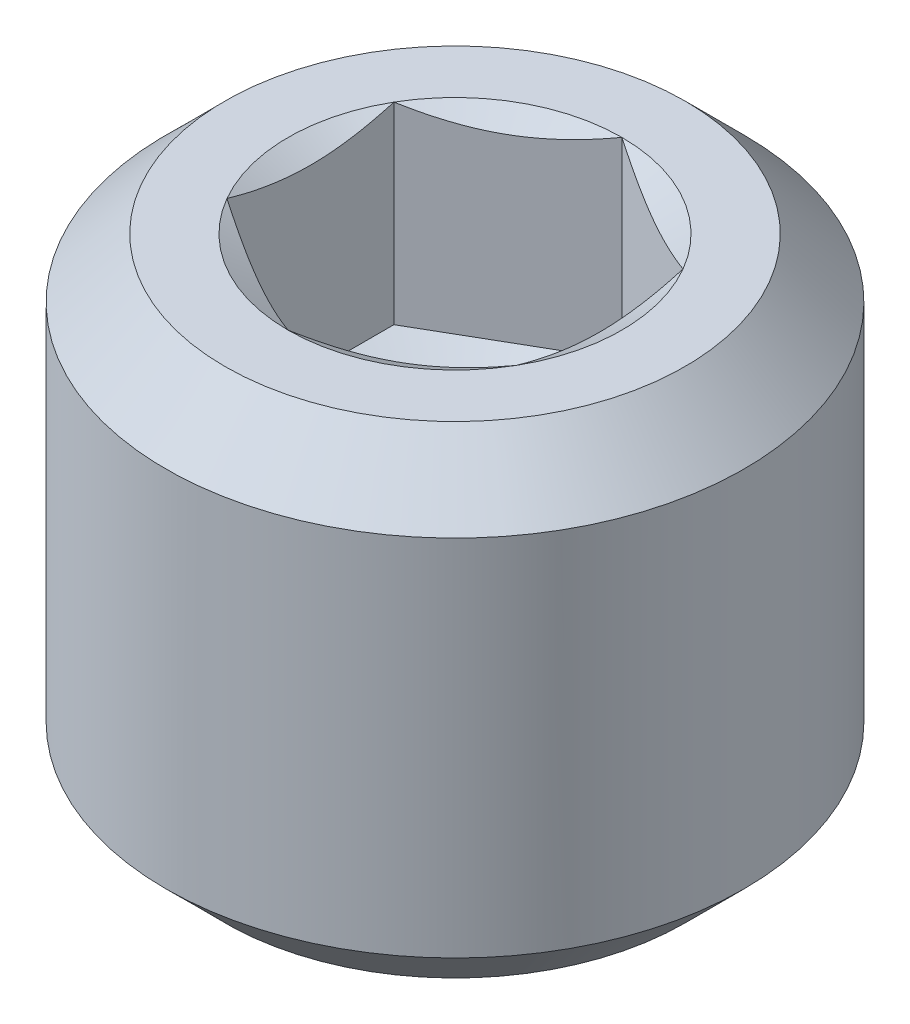
ISO-10303-21;
HEADER;
FILE_DESCRIPTION(('STEP AP214'),'2;1');
FILE_NAME('part.step','',(''),(''),'','','');
FILE_SCHEMA(('AUTOMOTIVE_DESIGN { 1 0 10303 214 1 1 1 1 }'));
ENDSEC;
DATA;
#1=APPLICATION_CONTEXT('core data for automotive mechanical design processes');
#2=APPLICATION_PROTOCOL_DEFINITION('international standard','automotive_design',2000,#1);
#3=PRODUCT_CONTEXT('',#1,'mechanical');
#4=PRODUCT('Part','Part','',(#3));
#5=PRODUCT_RELATED_PRODUCT_CATEGORY('part','',(#4));
#6=PRODUCT_DEFINITION_FORMATION('','',#4);
#7=PRODUCT_DEFINITION_CONTEXT('part definition',#1,'design');
#8=PRODUCT_DEFINITION('design','',#6,#7);
#9=PRODUCT_DEFINITION_SHAPE('','',#8);
#10=(LENGTH_UNIT() NAMED_UNIT(*) SI_UNIT(.MILLI.,.METRE.));
#11=(NAMED_UNIT(*) PLANE_ANGLE_UNIT() SI_UNIT($,.RADIAN.));
#12=(NAMED_UNIT(*) SI_UNIT($,.STERADIAN.) SOLID_ANGLE_UNIT());
#13=UNCERTAINTY_MEASURE_WITH_UNIT(LENGTH_MEASURE(1.E-05),#10,'distance_accuracy_value','');
#14=(GEOMETRIC_REPRESENTATION_CONTEXT(3) GLOBAL_UNCERTAINTY_ASSIGNED_CONTEXT((#13)) GLOBAL_UNIT_ASSIGNED_CONTEXT((#10,
#11,#12)) REPRESENTATION_CONTEXT('',''));
#15=CARTESIAN_POINT('',(0.,0.,0.));
#16=DIRECTION('',(0.,0.,1.));
#17=DIRECTION('',(1.,0.,0.));
#18=AXIS2_PLACEMENT_3D('',#15,#16,#17);
#19=CARTESIAN_POINT('',(0.,18.,17.5660254037844));
#20=DIRECTION('',(0.,1.,0.));
#21=DIRECTION('',(0.,0.,1.));
#22=AXIS2_PLACEMENT_3D('',#19,#20,#21);
#23=PLANE('',#22);
#24=CARTESIAN_POINT('',(0.,18.0000000000138,16.7));
#25=DIRECTION('',(0.,1.,0.));
#26=DIRECTION('',(0.,0.,1.));
#27=AXIS2_PLACEMENT_3D('',#24,#25,#26);
#28=CIRCLE('',#27,1.73205080763255);
#29=CARTESIAN_POINT('',(0.,17.9999999999124,14.9679491924546));
#30=VERTEX_POINT('',#29);
#31=CARTESIAN_POINT('',(1.50000000005516,18.0000000000138,15.8339745961838));
#32=VERTEX_POINT('',#31);
#33=EDGE_CURVE('E20',#30,#32,#28,.F.);
#34=ORIENTED_EDGE('',*,*,#33,.T.);
#35=DIRECTION('',(0.866025403784423,0.,0.500000000000027));
#36=VECTOR('',#35,1.);
#37=CARTESIAN_POINT('',(0.,18.,14.9679491924311));
#38=LINE('',#37,#36);
#39=EDGE_CURVE('E85',#30,#32,#38,.T.);
#40=ORIENTED_EDGE('',*,*,#39,.F.);
#41=EDGE_LOOP('',(#34,#40));
#42=FACE_BOUND('',#41,.T.);
#43=ADVANCED_FACE('F17',(#42),#23,.F.);
#44=CARTESIAN_POINT('',(0.,18.,17.5660254037844));
#45=DIRECTION('',(0.,1.,0.));
#46=DIRECTION('',(0.,0.,1.));
#47=AXIS2_PLACEMENT_3D('',#44,#45,#46);
#48=PLANE('',#47);
#49=CARTESIAN_POINT('',(0.,18.0000000000138,16.7));
#50=DIRECTION('',(0.,1.,0.));
#51=DIRECTION('',(0.,0.,1.));
#52=AXIS2_PLACEMENT_3D('',#49,#50,#51);
#53=CIRCLE('',#52,1.73205080763255);
#54=CARTESIAN_POINT('',(1.50000000005516,18.0000000000138,17.5660254038163));
#55=VERTEX_POINT('',#54);
#56=EDGE_CURVE('E112',#32,#55,#53,.F.);
#57=ORIENTED_EDGE('',*,*,#56,.T.);
#58=DIRECTION('',(0.,0.,1.));
#59=VECTOR('',#58,1.);
#60=CARTESIAN_POINT('',(1.5,18.,17.5660254037844));
#61=LINE('',#60,#59);
#62=EDGE_CURVE('E96',#32,#55,#61,.T.);
#63=ORIENTED_EDGE('',*,*,#62,.F.);
#64=EDGE_LOOP('',(#57,#63));
#65=FACE_BOUND('',#64,.T.);
#66=ADVANCED_FACE('F346',(#65),#48,.F.);
#67=CARTESIAN_POINT('',(0.,18.,17.5660254037844));
#68=DIRECTION('',(0.,1.,0.));
#69=DIRECTION('',(0.,0.,1.));
#70=AXIS2_PLACEMENT_3D('',#67,#68,#69);
#71=PLANE('',#70);
#72=CARTESIAN_POINT('',(0.,18.0000000000138,16.7));
#73=DIRECTION('',(0.,1.,0.));
#74=DIRECTION('',(0.,0.,1.));
#75=AXIS2_PLACEMENT_3D('',#72,#73,#74);
#76=CIRCLE('',#75,1.73205080763255);
#77=CARTESIAN_POINT('',(-2.98253199290998E-11,17.9999999999716,18.432050807531));
#78=VERTEX_POINT('',#77);
#79=EDGE_CURVE('E113',#55,#78,#76,.F.);
#80=ORIENTED_EDGE('',*,*,#79,.T.);
#81=DIRECTION('',(-0.866025403784424,0.,0.500000000000026));
#82=VECTOR('',#81,1.);
#83=CARTESIAN_POINT('',(1.5,18.,17.5660254037844));
#84=LINE('',#83,#82);
#85=EDGE_CURVE('E446',#55,#78,#84,.T.);
#86=ORIENTED_EDGE('',*,*,#85,.F.);
#87=EDGE_LOOP('',(#80,#86));
#88=FACE_BOUND('',#87,.T.);
#89=ADVANCED_FACE('F326',(#88),#71,.F.);
#90=CARTESIAN_POINT('',(0.,18.,17.5660254037844));
#91=DIRECTION('',(0.,1.,0.));
#92=DIRECTION('',(0.,0.,1.));
#93=AXIS2_PLACEMENT_3D('',#90,#91,#92);
#94=PLANE('',#93);
#95=CARTESIAN_POINT('',(0.,18.0000000000138,16.7));
#96=DIRECTION('',(0.,1.,0.));
#97=DIRECTION('',(0.,0.,1.));
#98=AXIS2_PLACEMENT_3D('',#95,#96,#97);
#99=CIRCLE('',#98,1.73205080763255);
#100=CARTESIAN_POINT('',(-1.50000000005516,18.0000000000138,17.5660254038163));
#101=VERTEX_POINT('',#100);
#102=EDGE_CURVE('E104',#78,#101,#99,.F.);
#103=ORIENTED_EDGE('',*,*,#102,.T.);
#104=DIRECTION('',(-0.866025403784424,0.,-0.500000000000026));
#105=VECTOR('',#104,1.);
#106=CARTESIAN_POINT('',(0.,18.,18.4320508075689));
#107=LINE('',#106,#105);
#108=EDGE_CURVE('E79',#78,#101,#107,.T.);
#109=ORIENTED_EDGE('',*,*,#108,.F.);
#110=EDGE_LOOP('',(#103,#109));
#111=FACE_BOUND('',#110,.T.);
#112=ADVANCED_FACE('F321',(#111),#94,.F.);
#113=CARTESIAN_POINT('',(0.,18.,17.5660254037844));
#114=DIRECTION('',(0.,1.,0.));
#115=DIRECTION('',(0.,0.,1.));
#116=AXIS2_PLACEMENT_3D('',#113,#114,#115);
#117=PLANE('',#116);
#118=CARTESIAN_POINT('',(0.,18.0000000000138,16.7));
#119=DIRECTION('',(0.,1.,0.));
#120=DIRECTION('',(0.,0.,1.));
#121=AXIS2_PLACEMENT_3D('',#118,#119,#120);
#122=CIRCLE('',#121,1.73205080763255);
#123=CARTESIAN_POINT('',(-1.50000000005516,18.0000000000138,15.8339745961838));
#124=VERTEX_POINT('',#123);
#125=EDGE_CURVE('E98',#124,#30,#122,.F.);
#126=ORIENTED_EDGE('',*,*,#125,.T.);
#127=DIRECTION('',(0.866025403784423,0.,-0.500000000000027));
#128=VECTOR('',#127,1.);
#129=CARTESIAN_POINT('',(-1.5,18.,15.8339745962156));
#130=LINE('',#129,#128);
#131=EDGE_CURVE('E69',#124,#30,#130,.T.);
#132=ORIENTED_EDGE('',*,*,#131,.F.);
#133=EDGE_LOOP('',(#126,#132));
#134=FACE_BOUND('',#133,.T.);
#135=ADVANCED_FACE('F99',(#134),#117,.F.);
#136=CARTESIAN_POINT('',(0.,17.9999999999154,16.7));
#137=DIRECTION('',(0.,1.,0.));
#138=DIRECTION('',(0.,0.,1.));
#139=AXIS2_PLACEMENT_3D('',#136,#137,#138);
#140=CONICAL_SURFACE('',#139,1.73205080746202,1.0471975510104);
#141=ORIENTED_EDGE('',*,*,#102,.F.);
#142=ORIENTED_EDGE('',*,*,#79,.F.);
#143=ORIENTED_EDGE('',*,*,#56,.F.);
#144=ORIENTED_EDGE('',*,*,#33,.F.);
#145=ORIENTED_EDGE('',*,*,#125,.F.);
#146=CARTESIAN_POINT('',(0.,18.0000000000138,16.7));
#147=DIRECTION('',(0.,1.,0.));
#148=DIRECTION('',(0.,0.,1.));
#149=AXIS2_PLACEMENT_3D('',#146,#147,#148);
#150=CIRCLE('',#149,1.73205080763255);
#151=EDGE_CURVE('E103',#124,#101,#150,.T.);
#152=ORIENTED_EDGE('',*,*,#151,.T.);
#153=EDGE_LOOP('',(#141,#142,#143,#144,#145,#152));
#154=FACE_BOUND('',#153,.T.);
#155=CARTESIAN_POINT('',(0.,16.9999999998538,16.7000000002418));
#156=VERTEX_POINT('',#155);
#157=VERTEX_LOOP('',#156);
#158=FACE_BOUND('',#157,.T.);
#159=ADVANCED_FACE('F108',(#154,#158),#140,.F.);
#160=CARTESIAN_POINT('',(0.,18.,17.5660254037844));
#161=DIRECTION('',(0.,1.,0.));
#162=DIRECTION('',(0.,0.,1.));
#163=AXIS2_PLACEMENT_3D('',#160,#161,#162);
#164=PLANE('',#163);
#165=ORIENTED_EDGE('',*,*,#151,.F.);
#166=DIRECTION('',(0.,0.,1.));
#167=VECTOR('',#166,1.);
#168=CARTESIAN_POINT('',(-1.5,18.,15.8339745962156));
#169=LINE('',#168,#167);
#170=EDGE_CURVE('E122',#124,#101,#169,.T.);
#171=ORIENTED_EDGE('',*,*,#170,.T.);
#172=EDGE_LOOP('',(#165,#171));
#173=FACE_BOUND('',#172,.T.);
#174=ADVANCED_FACE('F211',(#173),#164,.F.);
#175=CARTESIAN_POINT('',(-1.5,20.,17.5660254037844));
#176=DIRECTION('',(-0.5,0.,0.866025403784439));
#177=DIRECTION('',(0.866025403784439,0.,0.5));
#178=AXIS2_PLACEMENT_3D('',#175,#176,#177);
#179=PLANE('',#178);
#180=DIRECTION('',(0.,1.,0.));
#181=VECTOR('',#180,1.);
#182=CARTESIAN_POINT('',(0.,20.,18.4320508075689));
#183=LINE('',#182,#181);
#184=CARTESIAN_POINT('',(3.81032843018244E-11,19.9999999999792,18.4320508075408));
#185=VERTEX_POINT('',#184);
#186=EDGE_CURVE('E270',#185,#78,#183,.F.);
#187=ORIENTED_EDGE('',*,*,#186,.T.);
#188=ORIENTED_EDGE('',*,*,#108,.T.);
#189=DIRECTION('',(0.,1.,0.));
#190=VECTOR('',#189,1.);
#191=CARTESIAN_POINT('',(-1.5,20.,17.5660254037844));
#192=LINE('',#191,#190);
#193=CARTESIAN_POINT('',(-1.49999999997835,19.999999999981,17.5660254037719));
#194=VERTEX_POINT('',#193);
#195=EDGE_CURVE('E276',#101,#194,#192,.T.);
#196=ORIENTED_EDGE('',*,*,#195,.T.);
#197=CARTESIAN_POINT('',(-1.49999999998952,19.9999999999919,17.5660254037905));
#198=CARTESIAN_POINT('',(-1.43408408431797,19.9780216588395,17.6040819754473));
#199=CARTESIAN_POINT('',(-1.36759918340019,19.958033507822,17.6424670508892));
#200=CARTESIAN_POINT('',(-1.23347823997847,19.9231447905513,17.7199018136777));
#201=CARTESIAN_POINT('',(-1.16583981518067,19.9082565652565,17.7589528764423));
#202=CARTESIAN_POINT('',(-1.03140117467701,19.8850819692154,17.8365710617266));
#203=CARTESIAN_POINT('',(-0.964621638284761,19.8766413407045,17.875126245039));
#204=CARTESIAN_POINT('',(-0.830748509652482,19.8665668761059,17.9524179318921));
#205=CARTESIAN_POINT('',(-0.763655403670993,19.8649246954889,17.9911541546913));
#206=CARTESIAN_POINT('',(-0.638299132719481,19.8683497176239,18.0635286314697));
#207=CARTESIAN_POINT('',(-0.580017157019756,19.8725759639195,18.0971777458289));
#208=CARTESIAN_POINT('',(-0.463832893680693,19.8859679755443,18.1642567615433));
#209=CARTESIAN_POINT('',(-0.405931007591762,19.895138311081,18.1976864310633));
#210=CARTESIAN_POINT('',(-0.289507393713247,19.9180623750055,18.2649036358761));
#211=CARTESIAN_POINT('',(-0.231000393469883,19.9319132316638,18.2986826682161));
#212=CARTESIAN_POINT('',(-0.114858772505468,19.9633488206257,18.365737064344));
#213=CARTESIAN_POINT('',(-0.0572226650237925,19.9809261715583,18.3990132865136));
#214=CARTESIAN_POINT('',(-1.04600547231827E-11,19.9999999999919,18.4320508075628));
#215=B_SPLINE_CURVE_WITH_KNOTS('',3,(#197,#198,#199,#200,#201,#202,#203,#204,#205,#206,#207,
#208,#209,#210,#211,#212,#213,#214),.UNSPECIFIED.,.F.,.F.,(4,2,2,2,2,2,2,2,4),(0.,
0.237762008663058,0.476095362760998,0.708530704601941,0.94068066665728,1.14278083695486,
1.34506814532372,1.55184121684037,1.75820848010617),.UNSPECIFIED.);
#216=EDGE_CURVE('E123',#194,#185,#215,.T.);
#217=ORIENTED_EDGE('',*,*,#216,.T.);
#218=EDGE_LOOP('',(#187,#188,#196,#217));
#219=FACE_BOUND('',#218,.T.);
#220=ADVANCED_FACE('F137',(#219),#179,.F.);
#221=CARTESIAN_POINT('',(-1.5,20.,15.8339745962156));
#222=DIRECTION('',(-1.,0.,0.));
#223=DIRECTION('',(0.,0.,1.));
#224=AXIS2_PLACEMENT_3D('',#221,#222,#223);
#225=PLANE('',#224);
#226=ORIENTED_EDGE('',*,*,#195,.F.);
#227=ORIENTED_EDGE('',*,*,#170,.F.);
#228=DIRECTION('',(0.,1.,0.));
#229=VECTOR('',#228,1.);
#230=CARTESIAN_POINT('',(-1.50000000000002,20.,15.8339745962155));
#231=LINE('',#230,#229);
#232=CARTESIAN_POINT('',(-1.49999999997837,19.999999999981,15.8339745962281));
#233=VERTEX_POINT('',#232);
#234=EDGE_CURVE('E75',#124,#233,#231,.T.);
#235=ORIENTED_EDGE('',*,*,#234,.T.);
#236=CARTESIAN_POINT('',(-1.5,19.9999999999919,15.8339745962277));
#237=CARTESIAN_POINT('',(-1.5,19.9780216588395,15.9100877395414));
#238=CARTESIAN_POINT('',(-1.5,19.958033507822,15.9868578904253));
#239=CARTESIAN_POINT('',(-1.5,19.9231447905513,16.1417274160022));
#240=CARTESIAN_POINT('',(-1.5,19.9082565652566,16.2198295415314));
#241=CARTESIAN_POINT('',(-1.5,19.8850819692154,16.3750659120999));
#242=CARTESIAN_POINT('',(-1.5,19.8766413407045,16.4521762787248));
#243=CARTESIAN_POINT('',(-1.5,19.8665668761059,16.606759652431));
#244=CARTESIAN_POINT('',(-1.5,19.864924695489,16.6842320980293));
#245=CARTESIAN_POINT('',(-1.5,19.868349717624,16.8289810515863));
#246=CARTESIAN_POINT('',(-1.5,19.8725759639195,16.8962792803045));
#247=CARTESIAN_POINT('',(-1.5,19.8859679755443,17.0304373117333));
#248=CARTESIAN_POINT('',(-1.5,19.895138311081,17.0972966507734));
#249=CARTESIAN_POINT('',(-1.5,19.9180623750055,17.231731060399));
#250=CARTESIAN_POINT('',(-1.5,19.9319132316638,17.2992891250789));
#251=CARTESIAN_POINT('',(-1.5,19.9633488206257,17.4333979173348));
#252=CARTESIAN_POINT('',(-1.5,19.9809261715583,17.4999503616739));
#253=CARTESIAN_POINT('',(-1.5,19.9999999999919,17.5660254037723));
#254=B_SPLINE_CURVE_WITH_KNOTS('',3,(#236,#237,#238,#239,#240,#241,#242,#243,#244,#245,#246,
#247,#248,#249,#250,#251,#252,#253),.UNSPECIFIED.,.F.,.F.,(4,2,2,2,2,2,2,2,4),(0.,
0.237762008663058,0.47609536276099,0.708530704601928,0.940680666657268,1.14278083695483,
1.34506814532367,1.55184121684029,1.75820848010606),.UNSPECIFIED.);
#255=EDGE_CURVE('E130',#233,#194,#254,.T.);
#256=ORIENTED_EDGE('',*,*,#255,.T.);
#257=EDGE_LOOP('',(#226,#227,#235,#256));
#258=FACE_BOUND('',#257,.T.);
#259=ADVANCED_FACE('F202',(#258),#225,.F.);
#260=CARTESIAN_POINT('',(0.,20.,14.9679491924311));
#261=DIRECTION('',(-0.5,0.,-0.866025403784439));
#262=DIRECTION('',(-0.866025403784439,0.,0.5));
#263=AXIS2_PLACEMENT_3D('',#260,#261,#262);
#264=PLANE('',#263);
#265=ORIENTED_EDGE('',*,*,#234,.F.);
#266=ORIENTED_EDGE('',*,*,#131,.T.);
#267=DIRECTION('',(0.,1.,0.));
#268=VECTOR('',#267,1.);
#269=CARTESIAN_POINT('',(0.,20.,14.9679491924311));
#270=LINE('',#269,#268);
#271=CARTESIAN_POINT('',(0.,19.999999999981,14.9679491924561));
#272=VERTEX_POINT('',#271);
#273=EDGE_CURVE('E73',#30,#272,#270,.T.);
#274=ORIENTED_EDGE('',*,*,#273,.T.);
#275=CARTESIAN_POINT('',(-1.04993349927531E-11,19.9999999999919,14.9679491924372));
#276=CARTESIAN_POINT('',(-0.0659159156820543,19.9780216588395,15.006005764094));
#277=CARTESIAN_POINT('',(-0.13240081659984,19.9580335078221,15.0443908395359));
#278=CARTESIAN_POINT('',(-0.266521760021564,19.9231447905513,15.1218256023244));
#279=CARTESIAN_POINT('',(-0.334160184819363,19.9082565652566,15.160876665089));
#280=CARTESIAN_POINT('',(-0.468598825323031,19.8850819692154,15.2384948503733));
#281=CARTESIAN_POINT('',(-0.535378361715283,19.8766413407045,15.2770500336857));
#282=CARTESIAN_POINT('',(-0.669251490347559,19.8665668761059,15.3543417205388));
#283=CARTESIAN_POINT('',(-0.736344596329041,19.864924695489,15.393077943338));
#284=CARTESIAN_POINT('',(-0.861700867280555,19.868349717624,15.4654524201165));
#285=CARTESIAN_POINT('',(-0.919982842980286,19.8725759639195,15.4991015344756));
#286=CARTESIAN_POINT('',(-1.03616710631935,19.8859679755443,15.56618055019));
#287=CARTESIAN_POINT('',(-1.09406899240828,19.8951383110811,15.59961021971));
#288=CARTESIAN_POINT('',(-1.21049260628678,19.9180623750055,15.6668274245228));
#289=CARTESIAN_POINT('',(-1.26899960653014,19.9319132316638,15.7006064568628));
#290=CARTESIAN_POINT('',(-1.38514122749455,19.9633488206258,15.7676608529907));
#291=CARTESIAN_POINT('',(-1.44277733497622,19.9809261715583,15.8009370751603));
#292=CARTESIAN_POINT('',(-1.49999999998955,19.999999999992,15.8339745962095));
#293=B_SPLINE_CURVE_WITH_KNOTS('',3,(#275,#276,#277,#278,#279,#280,#281,#282,#283,#284,#285,
#286,#287,#288,#289,#290,#291,#292),.UNSPECIFIED.,.F.,.F.,(4,2,2,2,2,2,2,2,4),(0.,
0.237762008663067,0.476095362761011,0.708530704601959,0.940680666657307,1.14278083695488,
1.34506814532373,1.55184121684037,1.75820848010615),.UNSPECIFIED.);
#294=EDGE_CURVE('E193',#272,#233,#293,.T.);
#295=ORIENTED_EDGE('',*,*,#294,.T.);
#296=EDGE_LOOP('',(#265,#266,#274,#295));
#297=FACE_BOUND('',#296,.T.);
#298=ADVANCED_FACE('F71',(#297),#264,.F.);
#299=CARTESIAN_POINT('',(1.5,20.,15.8339745962156));
#300=DIRECTION('',(0.5,0.,-0.866025403784439));
#301=DIRECTION('',(-0.866025403784439,0.,-0.5));
#302=AXIS2_PLACEMENT_3D('',#299,#300,#301);
#303=PLANE('',#302);
#304=ORIENTED_EDGE('',*,*,#273,.F.);
#305=ORIENTED_EDGE('',*,*,#39,.T.);
#306=DIRECTION('',(0.,1.,0.));
#307=VECTOR('',#306,1.);
#308=CARTESIAN_POINT('',(1.5,20.,15.8339745962156));
#309=LINE('',#308,#307);
#310=CARTESIAN_POINT('',(1.49999999997835,19.999999999981,15.8339745962281));
#311=VERTEX_POINT('',#310);
#312=EDGE_CURVE('E90',#32,#311,#309,.T.);
#313=ORIENTED_EDGE('',*,*,#312,.T.);
#314=CARTESIAN_POINT('',(1.49999999998952,19.9999999999919,15.8339745962096));
#315=CARTESIAN_POINT('',(1.43408408431797,19.9780216588395,15.7959180245527));
#316=CARTESIAN_POINT('',(1.36759918340019,19.958033507822,15.7575329491108));
#317=CARTESIAN_POINT('',(1.23347823997847,19.9231447905513,15.6800981863223));
#318=CARTESIAN_POINT('',(1.16583981518067,19.9082565652565,15.6410471235577));
#319=CARTESIAN_POINT('',(1.03140117467701,19.8850819692154,15.5634289382734));
#320=CARTESIAN_POINT('',(0.964621638284759,19.8766413407045,15.524873754961));
#321=CARTESIAN_POINT('',(0.830748509652481,19.8665668761059,15.4475820681079));
#322=CARTESIAN_POINT('',(0.763655403670993,19.8649246954889,15.4088458453087));
#323=CARTESIAN_POINT('',(0.638299132719481,19.8683497176239,15.3364713685303));
#324=CARTESIAN_POINT('',(0.580017157019753,19.8725759639195,15.3028222541711));
#325=CARTESIAN_POINT('',(0.463832893680687,19.8859679755443,15.2357432384567));
#326=CARTESIAN_POINT('',(0.405931007591755,19.895138311081,15.2023135689367));
#327=CARTESIAN_POINT('',(0.28950739371324,19.9180623750055,15.1350963641239));
#328=CARTESIAN_POINT('',(0.231000393469876,19.9319132316638,15.1013173317839));
#329=CARTESIAN_POINT('',(0.114858772505462,19.9633488206257,15.034262935656));
#330=CARTESIAN_POINT('',(0.057222665023788,19.9809261715583,15.0009867134864));
#331=CARTESIAN_POINT('',(1.04570785879555E-11,19.9999999999919,14.9679491924372));
#332=B_SPLINE_CURVE_WITH_KNOTS('',3,(#314,#315,#316,#317,#318,#319,#320,#321,#322,#323,#324,
#325,#326,#327,#328,#329,#330,#331),.UNSPECIFIED.,.F.,.F.,(4,2,2,2,2,2,2,2,4),(0.,
0.237762008663061,0.476095362761001,0.708530704601943,0.940680666657281,1.14278083695487,
1.34506814532373,1.55184121684038,1.75820848010618),.UNSPECIFIED.);
#333=EDGE_CURVE('E88',#311,#272,#332,.T.);
#334=ORIENTED_EDGE('',*,*,#333,.T.);
#335=EDGE_LOOP('',(#304,#305,#313,#334));
#336=FACE_BOUND('',#335,.T.);
#337=ADVANCED_FACE('F84',(#336),#303,.F.);
#338=CARTESIAN_POINT('',(1.5,20.,17.5660254037844));
#339=DIRECTION('',(1.,0.,0.));
#340=DIRECTION('',(0.,0.,-1.));
#341=AXIS2_PLACEMENT_3D('',#338,#339,#340);
#342=PLANE('',#341);
#343=ORIENTED_EDGE('',*,*,#312,.F.);
#344=ORIENTED_EDGE('',*,*,#62,.T.);
#345=DIRECTION('',(0.,1.,0.));
#346=VECTOR('',#345,1.);
#347=CARTESIAN_POINT('',(1.50000000000002,20.,17.5660254037845));
#348=LINE('',#347,#346);
#349=CARTESIAN_POINT('',(1.49999999997836,19.999999999981,17.566025403772));
#350=VERTEX_POINT('',#349);
#351=EDGE_CURVE('E36',#55,#350,#348,.T.);
#352=ORIENTED_EDGE('',*,*,#351,.T.);
#353=CARTESIAN_POINT('',(1.5,19.9999999999919,17.5660254037723));
#354=CARTESIAN_POINT('',(1.5,19.9780216588395,17.4899122604586));
#355=CARTESIAN_POINT('',(1.5,19.958033507822,17.4131421095747));
#356=CARTESIAN_POINT('',(1.5,19.9231447905513,17.2582725839978));
#357=CARTESIAN_POINT('',(1.5,19.9082565652566,17.1801704584686));
#358=CARTESIAN_POINT('',(1.5,19.8850819692154,17.0249340879001));
#359=CARTESIAN_POINT('',(1.5,19.8766413407045,16.9478237212752));
#360=CARTESIAN_POINT('',(1.5,19.8665668761059,16.793240347569));
#361=CARTESIAN_POINT('',(1.5,19.864924695489,16.7157679019707));
#362=CARTESIAN_POINT('',(1.5,19.868349717624,16.5710189484137));
#363=CARTESIAN_POINT('',(1.5,19.8725759639195,16.5037207196955));
#364=CARTESIAN_POINT('',(1.5,19.8859679755443,16.3695626882667));
#365=CARTESIAN_POINT('',(1.5,19.895138311081,16.3027033492266));
#366=CARTESIAN_POINT('',(1.5,19.9180623750055,16.168268939601));
#367=CARTESIAN_POINT('',(1.5,19.9319132316638,16.1007108749211));
#368=CARTESIAN_POINT('',(1.5,19.9633488206257,15.9666020826652));
#369=CARTESIAN_POINT('',(1.5,19.9809261715583,15.9000496383261));
#370=CARTESIAN_POINT('',(1.5,19.9999999999919,15.8339745962277));
#371=B_SPLINE_CURVE_WITH_KNOTS('',3,(#353,#354,#355,#356,#357,#358,#359,#360,#361,#362,#363,
#364,#365,#366,#367,#368,#369,#370),.UNSPECIFIED.,.F.,.F.,(4,2,2,2,2,2,2,2,4),(0.,
0.237762008663058,0.476095362760994,0.708530704601928,0.940680666657264,1.14278083695483,
1.34506814532366,1.55184121684029,1.75820848010606),.UNSPECIFIED.);
#372=EDGE_CURVE('E165',#350,#311,#371,.T.);
#373=ORIENTED_EDGE('',*,*,#372,.T.);
#374=EDGE_LOOP('',(#343,#344,#352,#373));
#375=FACE_BOUND('',#374,.T.);
#376=ADVANCED_FACE('F152',(#375),#342,.F.);
#377=CARTESIAN_POINT('',(0.,20.,18.4320508075689));
#378=DIRECTION('',(0.5,0.,0.866025403784439));
#379=DIRECTION('',(0.866025403784439,0.,-0.5));
#380=AXIS2_PLACEMENT_3D('',#377,#378,#379);
#381=PLANE('',#380);
#382=ORIENTED_EDGE('',*,*,#351,.F.);
#383=ORIENTED_EDGE('',*,*,#85,.T.);
#384=ORIENTED_EDGE('',*,*,#186,.F.);
#385=CARTESIAN_POINT('',(1.04950709472283E-11,19.9999999999919,18.4320508075628));
#386=CARTESIAN_POINT('',(0.0659159156820464,19.9780216588395,18.393994235906));
#387=CARTESIAN_POINT('',(0.132400816599831,19.9580335078221,18.3556091604641));
#388=CARTESIAN_POINT('',(0.266521760021553,19.9231447905513,18.2781743976756));
#389=CARTESIAN_POINT('',(0.334160184819352,19.9082565652566,18.239123334911));
#390=CARTESIAN_POINT('',(0.468598825323013,19.8850819692154,18.1615051496267));
#391=CARTESIAN_POINT('',(0.53537836171526,19.8766413407045,18.1229499663143));
#392=CARTESIAN_POINT('',(0.669251490347545,19.8665668761059,18.0456582794612));
#393=CARTESIAN_POINT('',(0.73634459632904,19.864924695489,18.006922056662));
#394=CARTESIAN_POINT('',(0.861700867280551,19.868349717624,17.9345475798836));
#395=CARTESIAN_POINT('',(0.91998284298027,19.8725759639195,17.9008984655244));
#396=CARTESIAN_POINT('',(1.03616710631933,19.8859679755443,17.83381944981));
#397=CARTESIAN_POINT('',(1.09406899240826,19.8951383110811,17.80038978029));
#398=CARTESIAN_POINT('',(1.21049260628677,19.9180623750055,17.7331725754772));
#399=CARTESIAN_POINT('',(1.26899960653014,19.9319132316638,17.6993935431372));
#400=CARTESIAN_POINT('',(1.38514122749454,19.9633488206258,17.6323391470093));
#401=CARTESIAN_POINT('',(1.44277733497621,19.9809261715583,17.5990629248397));
#402=CARTESIAN_POINT('',(1.49999999998954,19.999999999992,17.5660254037905));
#403=B_SPLINE_CURVE_WITH_KNOTS('',3,(#385,#386,#387,#388,#389,#390,#391,#392,#393,#394,#395,
#396,#397,#398,#399,#400,#401,#402),.UNSPECIFIED.,.F.,.F.,(4,2,2,2,2,2,2,2,4),(0.,
0.237762008663064,0.476095362761003,0.708530704601945,0.940680666657287,1.14278083695487,
1.34506814532372,1.55184121684036,1.75820848010615),.UNSPECIFIED.);
#404=EDGE_CURVE('E157',#185,#350,#403,.T.);
#405=ORIENTED_EDGE('',*,*,#404,.T.);
#406=EDGE_LOOP('',(#382,#383,#384,#405));
#407=FACE_BOUND('',#406,.T.);
#408=ADVANCED_FACE('F145',(#407),#381,.F.);
#409=CARTESIAN_POINT('',(0.,19.9999999998681,16.7));
#410=DIRECTION('',(0.,1.,0.));
#411=DIRECTION('',(0.,0.,1.));
#412=AXIS2_PLACEMENT_3D('',#409,#410,#411);
#413=CONICAL_SURFACE('',#412,1.73205080734834,1.04719755123772);
#414=CARTESIAN_POINT('',(0.,19.9999999999666,16.7));
#415=DIRECTION('',(0.,1.,0.));
#416=DIRECTION('',(0.,0.,1.));
#417=AXIS2_PLACEMENT_3D('',#414,#415,#416);
#418=CIRCLE('',#417,1.73205080751886);
#419=EDGE_CURVE('E164',#185,#194,#418,.F.);
#420=ORIENTED_EDGE('',*,*,#419,.F.);
#421=ORIENTED_EDGE('',*,*,#216,.F.);
#422=EDGE_LOOP('',(#420,#421));
#423=FACE_BOUND('',#422,.T.);
#424=ADVANCED_FACE('F140',(#423),#413,.F.);
#425=CARTESIAN_POINT('',(0.,19.9999999998681,16.7));
#426=DIRECTION('',(0.,1.,0.));
#427=DIRECTION('',(0.,0.,1.));
#428=AXIS2_PLACEMENT_3D('',#425,#426,#427);
#429=CONICAL_SURFACE('',#428,1.73205080734834,1.04719755123772);
#430=CARTESIAN_POINT('',(0.,19.9999999999666,16.7));
#431=DIRECTION('',(0.,1.,0.));
#432=DIRECTION('',(0.,0.,1.));
#433=AXIS2_PLACEMENT_3D('',#430,#431,#432);
#434=CIRCLE('',#433,1.73205080751886);
#435=EDGE_CURVE('E262',#194,#233,#434,.F.);
#436=ORIENTED_EDGE('',*,*,#435,.F.);
#437=ORIENTED_EDGE('',*,*,#255,.F.);
#438=EDGE_LOOP('',(#436,#437));
#439=FACE_BOUND('',#438,.T.);
#440=ADVANCED_FACE('F144',(#439),#429,.F.);
#441=CARTESIAN_POINT('',(0.,19.9999999998681,16.7));
#442=DIRECTION('',(0.,1.,0.));
#443=DIRECTION('',(0.,0.,1.));
#444=AXIS2_PLACEMENT_3D('',#441,#442,#443);
#445=CONICAL_SURFACE('',#444,1.73205080734834,1.04719755123772);
#446=CARTESIAN_POINT('',(0.,19.9999999999666,16.7));
#447=DIRECTION('',(0.,1.,0.));
#448=DIRECTION('',(0.,0.,1.));
#449=AXIS2_PLACEMENT_3D('',#446,#447,#448);
#450=CIRCLE('',#449,1.73205080751886);
#451=EDGE_CURVE('E258',#233,#272,#450,.F.);
#452=ORIENTED_EDGE('',*,*,#451,.F.);
#453=ORIENTED_EDGE('',*,*,#294,.F.);
#454=EDGE_LOOP('',(#452,#453));
#455=FACE_BOUND('',#454,.T.);
#456=ADVANCED_FACE('F187',(#455),#445,.F.);
#457=CARTESIAN_POINT('',(0.,19.9999999998681,16.7));
#458=DIRECTION('',(0.,1.,0.));
#459=DIRECTION('',(0.,0.,1.));
#460=AXIS2_PLACEMENT_3D('',#457,#458,#459);
#461=CONICAL_SURFACE('',#460,1.73205080734834,1.04719755123772);
#462=CARTESIAN_POINT('',(0.,19.9999999999666,16.7));
#463=DIRECTION('',(0.,1.,0.));
#464=DIRECTION('',(0.,0.,1.));
#465=AXIS2_PLACEMENT_3D('',#462,#463,#464);
#466=CIRCLE('',#465,1.73205080751886);
#467=EDGE_CURVE('E253',#272,#311,#466,.F.);
#468=ORIENTED_EDGE('',*,*,#467,.F.);
#469=ORIENTED_EDGE('',*,*,#333,.F.);
#470=EDGE_LOOP('',(#468,#469));
#471=FACE_BOUND('',#470,.T.);
#472=ADVANCED_FACE('F183',(#471),#461,.F.);
#473=CARTESIAN_POINT('',(0.,19.9999999998681,16.7));
#474=DIRECTION('',(0.,1.,0.));
#475=DIRECTION('',(0.,0.,1.));
#476=AXIS2_PLACEMENT_3D('',#473,#474,#475);
#477=CONICAL_SURFACE('',#476,1.73205080734834,1.04719755123772);
#478=CARTESIAN_POINT('',(0.,19.9999999999666,16.7));
#479=DIRECTION('',(0.,1.,0.));
#480=DIRECTION('',(0.,0.,1.));
#481=AXIS2_PLACEMENT_3D('',#478,#479,#480);
#482=CIRCLE('',#481,1.73205080751886);
#483=EDGE_CURVE('E247',#311,#350,#482,.F.);
#484=ORIENTED_EDGE('',*,*,#483,.F.);
#485=ORIENTED_EDGE('',*,*,#372,.F.);
#486=EDGE_LOOP('',(#484,#485));
#487=FACE_BOUND('',#486,.T.);
#488=ADVANCED_FACE('F177',(#487),#477,.F.);
#489=CARTESIAN_POINT('',(0.,19.9999999998681,16.7));
#490=DIRECTION('',(0.,1.,0.));
#491=DIRECTION('',(0.,0.,1.));
#492=AXIS2_PLACEMENT_3D('',#489,#490,#491);
#493=CONICAL_SURFACE('',#492,1.73205080734834,1.04719755123772);
#494=CARTESIAN_POINT('',(0.,19.9999999999666,16.7));
#495=DIRECTION('',(0.,1.,0.));
#496=DIRECTION('',(0.,0.,1.));
#497=AXIS2_PLACEMENT_3D('',#494,#495,#496);
#498=CIRCLE('',#497,1.73205080751886);
#499=EDGE_CURVE('E250',#350,#185,#498,.F.);
#500=ORIENTED_EDGE('',*,*,#499,.F.);
#501=ORIENTED_EDGE('',*,*,#404,.F.);
#502=EDGE_LOOP('',(#500,#501));
#503=FACE_BOUND('',#502,.T.);
#504=ADVANCED_FACE('F172',(#503),#493,.F.);
#505=CARTESIAN_POINT('',(0.,15.,17.89325));
#506=DIRECTION('',(0.,-1.,0.));
#507=DIRECTION('',(0.,0.,-1.));
#508=AXIS2_PLACEMENT_3D('',#505,#506,#507);
#509=PLANE('',#508);
#510=CARTESIAN_POINT('',(0.,14.9999999999864,16.7));
#511=DIRECTION('',(0.,1.,0.));
#512=DIRECTION('',(-1.,0.,0.));
#513=AXIS2_PLACEMENT_3D('',#510,#511,#512);
#514=CIRCLE('',#513,2.3864999999576);
#515=CARTESIAN_POINT('',(-2.3864999999576,14.9999999999864,16.7));
#516=VERTEX_POINT('',#515);
#517=EDGE_CURVE('E256',#516,#516,#514,.T.);
#518=ORIENTED_EDGE('',*,*,#517,.F.);
#519=EDGE_LOOP('',(#518));
#520=FACE_BOUND('',#519,.T.);
#521=ADVANCED_FACE('F176',(#520),#509,.T.);
#522=CARTESIAN_POINT('',(0.,20.,17.89325));
#523=DIRECTION('',(0.,1.,0.));
#524=DIRECTION('',(0.,0.,1.));
#525=AXIS2_PLACEMENT_3D('',#522,#523,#524);
#526=PLANE('',#525);
#527=CARTESIAN_POINT('',(0.,19.9999999999818,16.7));
#528=DIRECTION('',(0.,-1.,0.));
#529=DIRECTION('',(0.,0.,-1.));
#530=AXIS2_PLACEMENT_3D('',#527,#528,#529);
#531=CIRCLE('',#530,2.38650000001444);
#532=CARTESIAN_POINT('',(0.,19.9999999999818,14.3134999999856));
#533=VERTEX_POINT('',#532);
#534=EDGE_CURVE('E242',#533,#533,#531,.T.);
#535=ORIENTED_EDGE('',*,*,#534,.F.);
#536=EDGE_LOOP('',(#535));
#537=FACE_BOUND('',#536,.T.);
#538=ORIENTED_EDGE('',*,*,#483,.T.);
#539=ORIENTED_EDGE('',*,*,#499,.T.);
#540=ORIENTED_EDGE('',*,*,#419,.T.);
#541=ORIENTED_EDGE('',*,*,#435,.T.);
#542=ORIENTED_EDGE('',*,*,#451,.T.);
#543=ORIENTED_EDGE('',*,*,#467,.T.);
#544=EDGE_LOOP('',(#538,#539,#540,#541,#542,#543));
#545=FACE_BOUND('',#544,.T.);
#546=ADVANCED_FACE('F230',(#537,#545),#526,.T.);
#547=CARTESIAN_POINT('',(0.,15.6134999999153,16.7));
#548=DIRECTION('',(0.,1.,0.));
#549=DIRECTION('',(-1.,0.,0.));
#550=AXIS2_PLACEMENT_3D('',#547,#548,#549);
#551=CONICAL_SURFACE('',#550,2.99999999988658,0.785398163397448);
#552=ORIENTED_EDGE('',*,*,#517,.T.);
#553=EDGE_LOOP('',(#552));
#554=FACE_BOUND('',#553,.T.);
#555=CARTESIAN_POINT('',(0.,15.6135,16.7));
#556=DIRECTION('',(0.,-1.,0.));
#557=DIRECTION('',(0.,0.,-1.));
#558=AXIS2_PLACEMENT_3D('',#555,#556,#557);
#559=CIRCLE('',#558,3.);
#560=CARTESIAN_POINT('',(0.,15.6135,13.7));
#561=VERTEX_POINT('',#560);
#562=EDGE_CURVE('E27',#561,#561,#559,.F.);
#563=ORIENTED_EDGE('',*,*,#562,.F.);
#564=EDGE_LOOP('',(#563));
#565=FACE_BOUND('',#564,.T.);
#566=ADVANCED_FACE('F223',(#554,#565),#551,.T.);
#567=CARTESIAN_POINT('',(0.,19.386499999996,16.7));
#568=DIRECTION('',(0.,-1.,0.));
#569=DIRECTION('',(0.,0.,-1.));
#570=AXIS2_PLACEMENT_3D('',#567,#568,#569);
#571=CONICAL_SURFACE('',#570,3.00000000000027,0.785398163397448);
#572=ORIENTED_EDGE('',*,*,#534,.T.);
#573=EDGE_LOOP('',(#572));
#574=FACE_BOUND('',#573,.T.);
#575=CARTESIAN_POINT('',(0.,19.3865,16.7));
#576=DIRECTION('',(0.,-1.,0.));
#577=DIRECTION('',(0.,0.,-1.));
#578=AXIS2_PLACEMENT_3D('',#575,#576,#577);
#579=CIRCLE('',#578,3.);
#580=CARTESIAN_POINT('',(0.,19.3865,13.7));
#581=VERTEX_POINT('',#580);
#582=EDGE_CURVE('E11',#581,#581,#579,.T.);
#583=ORIENTED_EDGE('',*,*,#582,.F.);
#584=EDGE_LOOP('',(#583));
#585=FACE_BOUND('',#584,.T.);
#586=ADVANCED_FACE('F216',(#574,#585),#571,.T.);
#587=CARTESIAN_POINT('',(0.,17.5,16.7));
#588=DIRECTION('',(0.,-1.,0.));
#589=DIRECTION('',(0.,0.,-1.));
#590=AXIS2_PLACEMENT_3D('',#587,#588,#589);
#591=CYLINDRICAL_SURFACE('',#590,3.);
#592=ORIENTED_EDGE('',*,*,#562,.T.);
#593=EDGE_LOOP('',(#592));
#594=FACE_BOUND('',#593,.T.);
#595=ORIENTED_EDGE('',*,*,#582,.T.);
#596=EDGE_LOOP('',(#595));
#597=FACE_BOUND('',#596,.T.);
#598=ADVANCED_FACE('F214',(#594,#597),#591,.T.);
#599=CLOSED_SHELL('',(#43,#66,#89,#112,#135,#159,#174,#220,#259,#298,#337,#376,#408,#424,#440,
#456,#472,#488,#504,#521,#546,#566,#586,#598));
#600=MANIFOLD_SOLID_BREP('B1',#599);
#601=ADVANCED_BREP_SHAPE_REPRESENTATION('',(#18,#600),#14);
#602=SHAPE_DEFINITION_REPRESENTATION(#9,#601);
ENDSEC;
END-ISO-10303-21;
